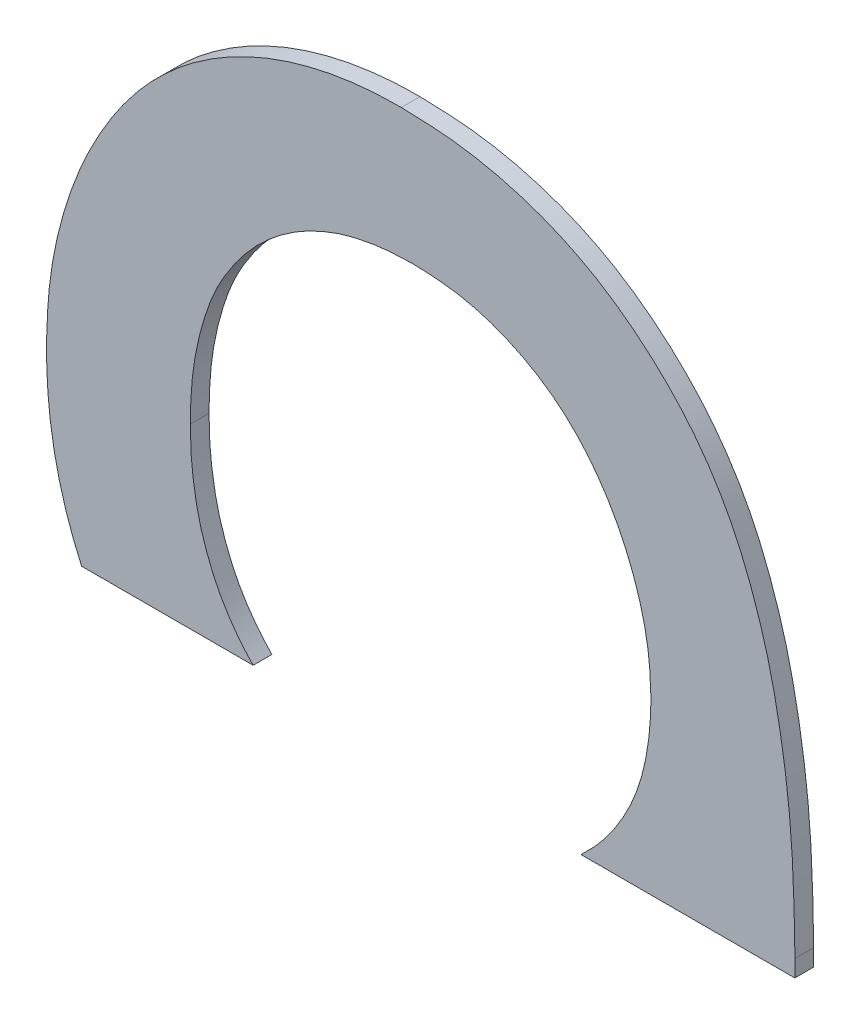
ISO-10303-21;
HEADER;
FILE_DESCRIPTION(('STEP AP214'),'2;1');
FILE_NAME('part.step','',(''),(''),'','','');
FILE_SCHEMA(('AUTOMOTIVE_DESIGN { 1 0 10303 214 1 1 1 1 }'));
ENDSEC;
DATA;
#1=APPLICATION_CONTEXT('core data for automotive mechanical design processes');
#2=APPLICATION_PROTOCOL_DEFINITION('international standard','automotive_design',2000,#1);
#3=PRODUCT_CONTEXT('',#1,'mechanical');
#4=PRODUCT('Part','Part','',(#3));
#5=PRODUCT_RELATED_PRODUCT_CATEGORY('part','',(#4));
#6=PRODUCT_DEFINITION_FORMATION('','',#4);
#7=PRODUCT_DEFINITION_CONTEXT('part definition',#1,'design');
#8=PRODUCT_DEFINITION('design','',#6,#7);
#9=PRODUCT_DEFINITION_SHAPE('','',#8);
#10=(LENGTH_UNIT() NAMED_UNIT(*) SI_UNIT(.MILLI.,.METRE.));
#11=(NAMED_UNIT(*) PLANE_ANGLE_UNIT() SI_UNIT($,.RADIAN.));
#12=(NAMED_UNIT(*) SI_UNIT($,.STERADIAN.) SOLID_ANGLE_UNIT());
#13=UNCERTAINTY_MEASURE_WITH_UNIT(LENGTH_MEASURE(1.E-05),#10,'distance_accuracy_value','');
#14=(GEOMETRIC_REPRESENTATION_CONTEXT(3) GLOBAL_UNCERTAINTY_ASSIGNED_CONTEXT((#13)) GLOBAL_UNIT_ASSIGNED_CONTEXT((#10,
#11,#12)) REPRESENTATION_CONTEXT('',''));
#15=CARTESIAN_POINT('',(0.,0.,0.));
#16=DIRECTION('',(0.,0.,1.));
#17=DIRECTION('',(1.,0.,0.));
#18=AXIS2_PLACEMENT_3D('',#15,#16,#17);
#19=CARTESIAN_POINT('',(-0.751201923076926,-4.61538461538461,0.5));
#20=CARTESIAN_POINT('',(-1.05208136722409,-4.6073141245753,0.5));
#21=CARTESIAN_POINT('',(-1.64652592040356,-4.59136933540342,0.5));
#22=CARTESIAN_POINT('',(-2.52174364885176,-4.46427746787016,0.5));
#23=CARTESIAN_POINT('',(-3.35965405508428,-4.24438969088595,0.5));
#24=CARTESIAN_POINT('',(-4.16805477719404,-3.95105285190534,0.5));
#25=CARTESIAN_POINT('',(-4.93626094891644,-3.56177482233258,0.5));
#26=CARTESIAN_POINT('',(-5.67726773130089,-3.09868306532259,0.5));
#27=CARTESIAN_POINT('',(-6.37478429479077,-2.53834942335427,0.5));
#28=CARTESIAN_POINT('',(-7.03748292644929,-1.90788221862828,0.5));
#29=CARTESIAN_POINT('',(-7.64393124396025,-1.20720674974773,0.5));
#30=CARTESIAN_POINT('',(-8.17223120863696,-0.449278447272661,0.5));
#31=CARTESIAN_POINT('',(-8.62332598090292,0.356403135815878,0.5));
#32=CARTESIAN_POINT('',(-8.98197896681654,1.21479841384775,0.5));
#33=CARTESIAN_POINT('',(-9.26618566706988,2.12202585891722,0.5));
#34=CARTESIAN_POINT('',(-9.46905048683821,3.07755895409878,0.5));
#35=CARTESIAN_POINT('',(-9.59116435200514,4.08337678900219,0.5));
#36=CARTESIAN_POINT('',(-9.60718732743484,4.76928467203447,0.5));
#37=CARTESIAN_POINT('',(-9.61538461538462,5.12019230769231,0.5));
#38=B_SPLINE_CURVE_WITH_KNOTS('',3,(#19,#20,#21,#22,#23,#24,#25,#26,#27,#28,#29,#30,#31,#32,#33,
#34,#35,#36,#37),.UNSPECIFIED.,.F.,.F.,(4,1,1,1,1,1,1,1,1,1,1,1,1,1,1,1,4),(0.,
0.0613500156391669,0.121208621404991,0.179871554014015,0.237779878975049,0.296247579069997,
0.355188698054684,0.415676988356908,0.478383266634535,0.54153119524827,0.604321267255817,
0.666503625249698,0.729484807150661,0.793706037151852,0.860134946175092,0.928445617023847,1.),.UNSPECIFIED.);
#39=DIRECTION('',(0.,0.,1.));
#40=VECTOR('',#39,1.);
#41=SURFACE_OF_LINEAR_EXTRUSION('',#38,#40);
#42=CARTESIAN_POINT('',(-8.67208105475277,0.5,0.49999999999993));
#43=VERTEX_POINT('',#42);
#44=CARTESIAN_POINT('',(-9.61538461538462,5.12019230769231,0.5));
#45=VERTEX_POINT('',#44);
#46=EDGE_CURVE('E136',#43,#45,#38,.T.);
#47=ORIENTED_EDGE('',*,*,#46,.F.);
#48=DIRECTION('',(0.,0.,1.));
#49=VECTOR('',#48,1.);
#50=CARTESIAN_POINT('',(-8.67208105475715,0.5,0.5));
#51=LINE('',#50,#49);
#52=CARTESIAN_POINT('',(-8.67208105475277,0.5,1.));
#53=VERTEX_POINT('',#52);
#54=EDGE_CURVE('E125',#43,#53,#51,.T.);
#55=ORIENTED_EDGE('',*,*,#54,.T.);
#56=CARTESIAN_POINT('',(-0.751201923076926,-4.61538461538461,1.));
#57=CARTESIAN_POINT('',(-1.05208136722409,-4.6073141245753,1.));
#58=CARTESIAN_POINT('',(-1.64652592040356,-4.59136933540342,1.));
#59=CARTESIAN_POINT('',(-2.52174364885176,-4.46427746787016,1.));
#60=CARTESIAN_POINT('',(-3.35965405508428,-4.24438969088595,1.));
#61=CARTESIAN_POINT('',(-4.16805477719404,-3.95105285190534,1.));
#62=CARTESIAN_POINT('',(-4.93626094891644,-3.56177482233258,1.));
#63=CARTESIAN_POINT('',(-5.67726773130089,-3.09868306532259,1.));
#64=CARTESIAN_POINT('',(-6.37478429479077,-2.53834942335427,1.));
#65=CARTESIAN_POINT('',(-7.03748292644929,-1.90788221862828,1.));
#66=CARTESIAN_POINT('',(-7.64393124396025,-1.20720674974773,1.));
#67=CARTESIAN_POINT('',(-8.17223120863696,-0.449278447272661,1.));
#68=CARTESIAN_POINT('',(-8.62332598090292,0.356403135815878,1.));
#69=CARTESIAN_POINT('',(-8.98197896681654,1.21479841384775,1.));
#70=CARTESIAN_POINT('',(-9.26618566706988,2.12202585891722,1.));
#71=CARTESIAN_POINT('',(-9.46905048683821,3.07755895409878,1.));
#72=CARTESIAN_POINT('',(-9.59116435200514,4.08337678900219,1.));
#73=CARTESIAN_POINT('',(-9.60718732743484,4.76928467203447,1.));
#74=CARTESIAN_POINT('',(-9.61538461538462,5.12019230769231,1.));
#75=B_SPLINE_CURVE_WITH_KNOTS('',3,(#56,#57,#58,#59,#60,#61,#62,#63,#64,#65,#66,#67,#68,#69,#70,
#71,#72,#73,#74),.UNSPECIFIED.,.F.,.F.,(4,1,1,1,1,1,1,1,1,1,1,1,1,1,1,1,4),(0.,
0.0613500156391669,0.121208621404991,0.179871554014015,0.237779878975049,0.296247579069997,
0.355188698054684,0.415676988356908,0.478383266634535,0.54153119524827,0.604321267255817,
0.666503625249698,0.729484807150661,0.793706037151852,0.860134946175092,0.928445617023847,1.),.UNSPECIFIED.);
#76=CARTESIAN_POINT('',(-9.61538461538462,5.12019230769231,1.));
#77=VERTEX_POINT('',#76);
#78=EDGE_CURVE('E127',#53,#77,#75,.T.);
#79=ORIENTED_EDGE('',*,*,#78,.T.);
#80=DIRECTION('',(0.,0.,1.));
#81=VECTOR('',#80,1.);
#82=CARTESIAN_POINT('',(-9.61538461538462,5.12019230769231,0.5));
#83=LINE('',#82,#81);
#84=EDGE_CURVE('E143',#45,#77,#83,.T.);
#85=ORIENTED_EDGE('',*,*,#84,.F.);
#86=EDGE_LOOP('',(#47,#55,#79,#85));
#87=FACE_BOUND('',#86,.T.);
#88=ADVANCED_FACE('F39',(#87),#41,.F.);
#89=CARTESIAN_POINT('',(10.3846153846154,0.955528846153846,0.5));
#90=CARTESIAN_POINT('',(10.3821977142456,0.602943470335043,0.5));
#91=CARTESIAN_POINT('',(10.3774297635366,-0.0923993330622221,0.5));
#92=CARTESIAN_POINT('',(10.3430890811823,-1.11663879616051,0.5));
#93=CARTESIAN_POINT('',(10.2753772341115,-2.10441400548949,0.5));
#94=CARTESIAN_POINT('',(10.1863756728696,-3.05443693995836,0.5));
#95=CARTESIAN_POINT('',(10.0717015147196,-3.9682283986958,0.5));
#96=CARTESIAN_POINT('',(9.93709266733864,-4.84519617463858,0.5));
#97=CARTESIAN_POINT('',(9.76535153213138,-5.68411287015175,0.5));
#98=CARTESIAN_POINT('',(9.57638652763186,-6.48683172140972,0.5));
#99=CARTESIAN_POINT('',(9.35717288971194,-7.25390389678419,0.5));
#100=CARTESIAN_POINT('',(9.12160097875744,-7.98629697891753,0.5));
#101=CARTESIAN_POINT('',(8.84819772702446,-8.67864494150063,0.5));
#102=CARTESIAN_POINT('',(8.55475591867812,-9.33514237132313,0.5));
#103=CARTESIAN_POINT('',(8.23544144492812,-9.95482744519533,0.5));
#104=CARTESIAN_POINT('',(7.8954990200966,-10.5400820912108,0.5));
#105=CARTESIAN_POINT('',(7.51972152317449,-11.083398874254,0.5));
#106=CARTESIAN_POINT('',(7.24946852493487,-11.4237069092656,0.5));
#107=CARTESIAN_POINT('',(7.11538461538461,-11.5925480769231,0.5));
#108=B_SPLINE_CURVE_WITH_KNOTS('',3,(#89,#90,#91,#92,#93,#94,#95,#96,#97,#98,#99,#100,#101,#102,
#103,#104,#105,#106,#107),.UNSPECIFIED.,.F.,.F.,(4,1,1,1,1,1,1,1,1,1,1,1,1,1,1,1,4),(0.,
0.0800277717235732,0.157824853088924,0.232558913600784,0.304720401798522,0.374368665994503,
0.441569713459507,0.506038880147261,0.568678357004664,0.628697033085732,0.687072628177058,
0.743220712025028,0.797557571320743,0.850225217791088,0.901379566966964,0.951070244146251,1.),.UNSPECIFIED.);
#109=DIRECTION('',(0.,0.,1.));
#110=VECTOR('',#109,1.);
#111=SURFACE_OF_LINEAR_EXTRUSION('',#108,#110);
#112=CARTESIAN_POINT('',(10.3846153846154,0.955528846153846,1.));
#113=CARTESIAN_POINT('',(10.3821977142456,0.602943470335043,1.));
#114=CARTESIAN_POINT('',(10.3774297635366,-0.0923993330622221,1.));
#115=CARTESIAN_POINT('',(10.3430890811823,-1.11663879616051,1.));
#116=CARTESIAN_POINT('',(10.2753772341115,-2.10441400548949,1.));
#117=CARTESIAN_POINT('',(10.1863756728696,-3.05443693995836,1.));
#118=CARTESIAN_POINT('',(10.0717015147196,-3.9682283986958,1.));
#119=CARTESIAN_POINT('',(9.93709266733864,-4.84519617463858,1.));
#120=CARTESIAN_POINT('',(9.76535153213138,-5.68411287015175,1.));
#121=CARTESIAN_POINT('',(9.57638652763186,-6.48683172140972,1.));
#122=CARTESIAN_POINT('',(9.35717288971194,-7.25390389678419,1.));
#123=CARTESIAN_POINT('',(9.12160097875744,-7.98629697891753,1.));
#124=CARTESIAN_POINT('',(8.84819772702446,-8.67864494150063,1.));
#125=CARTESIAN_POINT('',(8.55475591867812,-9.33514237132313,1.));
#126=CARTESIAN_POINT('',(8.23544144492812,-9.95482744519533,1.));
#127=CARTESIAN_POINT('',(7.8954990200966,-10.5400820912108,1.));
#128=CARTESIAN_POINT('',(7.51972152317449,-11.083398874254,1.));
#129=CARTESIAN_POINT('',(7.24946852493487,-11.4237069092656,1.));
#130=CARTESIAN_POINT('',(7.11538461538461,-11.5925480769231,1.));
#131=B_SPLINE_CURVE_WITH_KNOTS('',3,(#112,#113,#114,#115,#116,#117,#118,#119,#120,#121,#122,
#123,#124,#125,#126,#127,#128,#129,#130),.UNSPECIFIED.,.F.,.F.,(4,1,1,1,1,1,1,1,1,1,1,1,1,1,1,1,
4),(0.,0.0800277717235732,0.157824853088924,0.232558913600784,0.304720401798522,
0.374368665994503,0.441569713459507,0.506038880147261,0.568678357004664,0.628697033085732,
0.687072628177058,0.743220712025028,0.797557571320743,0.850225217791088,0.901379566966964,
0.951070244146251,1.),.UNSPECIFIED.);
#132=CARTESIAN_POINT('',(10.3846153846154,0.955528846153846,1.));
#133=VERTEX_POINT('',#132);
#134=CARTESIAN_POINT('',(10.3811111009625,0.5,1.));
#135=VERTEX_POINT('',#134);
#136=EDGE_CURVE('E158',#133,#135,#131,.T.);
#137=ORIENTED_EDGE('',*,*,#136,.T.);
#138=DIRECTION('',(0.,0.,1.));
#139=VECTOR('',#138,1.);
#140=CARTESIAN_POINT('',(10.3811111009625,0.5,0.5));
#141=LINE('',#140,#139);
#142=CARTESIAN_POINT('',(10.3811111009625,0.5,0.499999999999928));
#143=VERTEX_POINT('',#142);
#144=EDGE_CURVE('E58',#135,#143,#141,.F.);
#145=ORIENTED_EDGE('',*,*,#144,.T.);
#146=CARTESIAN_POINT('',(10.3846153846154,0.955528846153846,0.5));
#147=VERTEX_POINT('',#146);
#148=EDGE_CURVE('E153',#147,#143,#108,.T.);
#149=ORIENTED_EDGE('',*,*,#148,.F.);
#150=DIRECTION('',(0.,0.,1.));
#151=VECTOR('',#150,1.);
#152=CARTESIAN_POINT('',(10.3846153846154,0.955528846153846,0.5));
#153=LINE('',#152,#151);
#154=EDGE_CURVE('E202',#147,#133,#153,.T.);
#155=ORIENTED_EDGE('',*,*,#154,.T.);
#156=EDGE_LOOP('',(#137,#145,#149,#155));
#157=FACE_BOUND('',#156,.T.);
#158=ADVANCED_FACE('F170',(#157),#111,.F.);
#159=CARTESIAN_POINT('',(-6.48674058951894,-12.9439054380009,0.5));
#160=DIRECTION('',(0.,0.,1.));
#161=DIRECTION('',(0.,-1.,0.));
#162=AXIS2_PLACEMENT_3D('',#159,#160,#161);
#163=PLANE('',#162);
#164=ORIENTED_EDGE('',*,*,#148,.T.);
#165=DIRECTION('',(-1.,0.,0.));
#166=VECTOR('',#165,1.);
#167=CARTESIAN_POINT('',(-6.48674058951894,0.5,0.499999999999929));
#168=LINE('',#167,#166);
#169=CARTESIAN_POINT('',(4.66752853540583,0.500000000000001,0.5));
#170=VERTEX_POINT('',#169);
#171=EDGE_CURVE('E145',#143,#170,#168,.T.);
#172=ORIENTED_EDGE('',*,*,#171,.T.);
#173=CARTESIAN_POINT('',(0.312499999999997,-1.15384615384615,0.5));
#174=CARTESIAN_POINT('',(0.525181620843557,-1.15052628186562,0.5));
#175=CARTESIAN_POINT('',(0.944290969527386,-1.14398415858315,0.5));
#176=CARTESIAN_POINT('',(1.55888442998283,-1.05335744478311,0.5));
#177=CARTESIAN_POINT('',(2.15135861981619,-0.924500664957572,0.5));
#178=CARTESIAN_POINT('',(2.71873350548303,-0.736200358989074,0.5));
#179=CARTESIAN_POINT('',(3.26187993920832,-0.497381270453801,0.5));
#180=CARTESIAN_POINT('',(3.77444532617358,-0.195966551531516,0.5));
#181=CARTESIAN_POINT('',(4.27230429312932,0.14266349233154,0.5));
#182=CARTESIAN_POINT('',(4.72925431112541,0.548351553100201,0.5));
#183=CARTESIAN_POINT('',(5.15751420700751,0.986063218768481,0.5));
#184=CARTESIAN_POINT('',(5.52382964577491,1.4714058416857,0.5));
#185=CARTESIAN_POINT('',(5.83829932064355,1.98443429725264,0.5));
#186=CARTESIAN_POINT('',(6.10014231192655,2.52874864371322,0.5));
#187=CARTESIAN_POINT('',(6.29906273963224,3.10979085232619,0.5));
#188=CARTESIAN_POINT('',(6.43408372567748,3.7250009629822,0.5));
#189=CARTESIAN_POINT('',(6.52116993396109,4.37253099910386,0.5));
#190=CARTESIAN_POINT('',(6.53260799394781,4.81541624209692,0.5));
#191=CARTESIAN_POINT('',(6.53846153846154,5.04206730769231,0.5));
#192=B_SPLINE_CURVE_WITH_KNOTS('',3,(#173,#174,#175,#176,#177,#178,#179,#180,#181,#182,#183,
#184,#185,#186,#187,#188,#189,#190,#191),.UNSPECIFIED.,.F.,.F.,(4,1,1,1,1,1,1,1,1,1,1,1,1,1,1,1,
4),(0.,0.0648134675243328,0.127721098101111,0.189090647128161,0.249568581464557,
0.309746375316349,0.369694185537686,0.43071293525297,0.493078171473314,0.555739028721918,
0.617208872237963,0.678092868476808,0.739038153231513,0.801064241544692,0.864952355745952,
0.930887982924266,1.),.UNSPECIFIED.);
#193=CARTESIAN_POINT('',(6.53846153846154,5.04206730769231,0.5));
#194=VERTEX_POINT('',#193);
#195=EDGE_CURVE('E185',#170,#194,#192,.T.);
#196=ORIENTED_EDGE('',*,*,#195,.T.);
#197=CARTESIAN_POINT('',(6.53846153846154,5.04206730769231,0.5));
#198=CARTESIAN_POINT('',(6.52770505709414,5.34320083488285,0.5));
#199=CARTESIAN_POINT('',(6.50633330664684,5.94151457472179,0.5));
#200=CARTESIAN_POINT('',(6.34496615532058,6.82804757866898,0.5));
#201=CARTESIAN_POINT('',(6.07701568166938,7.69179131329034,0.5));
#202=CARTESIAN_POINT('',(5.71500345606536,8.52585861030982,0.5));
#203=CARTESIAN_POINT('',(5.26329480367352,9.30225326856521,0.5));
#204=CARTESIAN_POINT('',(4.73337273483055,9.99465493542181,0.5));
#205=CARTESIAN_POINT('',(4.1266913803003,10.58490349229,0.5));
#206=CARTESIAN_POINT('',(3.44726882169802,11.0701727775004,0.5));
#207=CARTESIAN_POINT('',(2.70412349955887,11.4471876199604,0.5));
#208=CARTESIAN_POINT('',(1.90787075377625,11.7300672949242,0.5));
#209=CARTESIAN_POINT('',(1.05231904469708,11.8932703093732,0.5));
#210=CARTESIAN_POINT('',(0.463427389534738,11.9129913139496,0.5));
#211=CARTESIAN_POINT('',(0.162259615384613,11.9230769230769,0.5));
#212=B_SPLINE_CURVE_WITH_KNOTS('',3,(#197,#198,#199,#200,#201,#202,#203,#204,#205,#206,#207,
#208,#209,#210,#211),.UNSPECIFIED.,.F.,.F.,(4,1,1,1,1,1,1,1,1,1,1,1,4),(0.,0.0861976277555787,
0.171263643436991,0.257086364057951,0.344684993816873,0.431063751283395,0.513672891938998,
0.593587340757752,0.672538692657252,0.751810301585755,0.831452538960071,0.913802372244421,1.),.UNSPECIFIED.);
#213=CARTESIAN_POINT('',(0.162259615384613,11.9230769230769,0.5));
#214=VERTEX_POINT('',#213);
#215=EDGE_CURVE('E186',#194,#214,#212,.T.);
#216=ORIENTED_EDGE('',*,*,#215,.T.);
#217=CARTESIAN_POINT('',(0.162259615384613,11.9230769230769,0.5));
#218=CARTESIAN_POINT('',(-0.0524070483761286,11.9172976812207,0.5));
#219=CARTESIAN_POINT('',(-0.47141739011508,11.9060171122552,0.5));
#220=CARTESIAN_POINT('',(-1.08474570451024,11.8178428606085,0.5));
#221=CARTESIAN_POINT('',(-1.66874208938719,11.6845769858313,0.5));
#222=CARTESIAN_POINT('',(-2.22066504010848,11.4806116659245,0.5));
#223=CARTESIAN_POINT('',(-2.74435856761598,11.2309346759247,0.5));
#224=CARTESIAN_POINT('',(-3.2372152886433,10.9188549561527,0.5));
#225=CARTESIAN_POINT('',(-3.69936923709171,10.5531208923731,0.5));
#226=CARTESIAN_POINT('',(-4.12583437983045,10.1314299110723,0.5));
#227=CARTESIAN_POINT('',(-4.51131732161061,9.66256324088065,0.5));
#228=CARTESIAN_POINT('',(-4.84623747019051,9.14924678946766,0.5));
#229=CARTESIAN_POINT('',(-5.1420069466192,8.59996710435281,0.5));
#230=CARTESIAN_POINT('',(-5.36447190921372,8.0012145581238,0.5));
#231=CARTESIAN_POINT('',(-5.54574891097962,7.36833168254641,0.5));
#232=CARTESIAN_POINT('',(-5.67902205628037,6.69533350531248,0.5));
#233=CARTESIAN_POINT('',(-5.75726742914501,5.98144755626492,0.5));
#234=CARTESIAN_POINT('',(-5.76518523772485,5.49098298120125,0.5));
#235=CARTESIAN_POINT('',(-5.76923076923077,5.24038461538462,0.5));
#236=B_SPLINE_CURVE_WITH_KNOTS('',3,(#217,#218,#219,#220,#221,#222,#223,#224,#225,#226,#227,
#228,#229,#230,#231,#232,#233,#234,#235),.UNSPECIFIED.,.F.,.F.,(4,1,1,1,1,1,1,1,1,1,1,1,1,1,1,1,
4),(0.,0.063966376214778,0.124856708945873,0.18438779716389,0.242192626151957,0.299883213184887,
0.357042851091169,0.415705001881656,0.475245074794211,0.535496623465662,0.596281447262161,
0.657719827357932,0.721044660647972,0.786256059909936,0.853830758406699,0.925316169733188,1.),.UNSPECIFIED.);
#237=CARTESIAN_POINT('',(-5.76923076923077,5.24038461538462,0.5));
#238=VERTEX_POINT('',#237);
#239=EDGE_CURVE('E191',#214,#238,#236,.T.);
#240=ORIENTED_EDGE('',*,*,#239,.T.);
#241=CARTESIAN_POINT('',(-5.76923076923077,5.24038461538462,0.5));
#242=CARTESIAN_POINT('',(-5.76548307373403,4.99973713439808,0.5));
#243=CARTESIAN_POINT('',(-5.75815398225742,4.52912061731442,0.5));
#244=CARTESIAN_POINT('',(-5.67552539760887,3.84241663759643,0.5));
#245=CARTESIAN_POINT('',(-5.55546886049067,3.19314256278714,0.5));
#246=CARTESIAN_POINT('',(-5.36950630431865,2.58541542280607,0.5));
#247=CARTESIAN_POINT('',(-5.14577017622293,2.01570219900155,0.5));
#248=CARTESIAN_POINT('',(-4.86555757943063,1.4856655008551,0.5));
#249=CARTESIAN_POINT('',(-4.53315107267522,0.995798413937763,0.5));
#250=CARTESIAN_POINT('',(-4.14927139890298,0.547436953164793,0.5));
#251=CARTESIAN_POINT('',(-3.72466431145232,0.143143069699442,0.5));
#252=CARTESIAN_POINT('',(-3.25437334938526,-0.202549579727881,0.5));
#253=CARTESIAN_POINT('',(-2.75047616777364,-0.496086072099569,0.5));
#254=CARTESIAN_POINT('',(-2.20943647475582,-0.74007647590807,0.5));
#255=CARTESIAN_POINT('',(-1.63050325211092,-0.925636184295902,0.5));
#256=CARTESIAN_POINT('',(-1.0140014190199,-1.05446425752607,0.5));
#257=CARTESIAN_POINT('',(-0.363202494055206,-1.14432663576168,0.5));
#258=CARTESIAN_POINT('',(0.0838132339991019,-1.15062433977298,0.5));
#259=CARTESIAN_POINT('',(0.312499999999997,-1.15384615384615,0.5));
#260=B_SPLINE_CURVE_WITH_KNOTS('',3,(#241,#242,#243,#244,#245,#246,#247,#248,#249,#250,#251,
#252,#253,#254,#255,#256,#257,#258,#259),.UNSPECIFIED.,.F.,.F.,(4,1,1,1,1,1,1,1,1,1,1,1,1,1,1,1,
4),(0.,0.0722026535685907,0.141201400518914,0.207364092776097,0.270147375692274,
0.331676873716226,0.390857640059306,0.449735156775021,0.50902581116344,0.567731099086861,
0.62534201751626,0.683822031340533,0.742499592485817,0.80316493575478,0.865913649548624,
0.931403366984299,1.),.UNSPECIFIED.);
#261=CARTESIAN_POINT('',(-4.08978851176382,0.500000000000275,0.5));
#262=VERTEX_POINT('',#261);
#263=EDGE_CURVE('E139',#238,#262,#260,.T.);
#264=ORIENTED_EDGE('',*,*,#263,.T.);
#265=EDGE_CURVE('E79',#262,#43,#168,.T.);
#266=ORIENTED_EDGE('',*,*,#265,.T.);
#267=ORIENTED_EDGE('',*,*,#46,.T.);
#268=CARTESIAN_POINT('',(-9.61538461538462,5.12019230769231,0.5));
#269=CARTESIAN_POINT('',(-9.60013607534619,5.5838327825477,0.5));
#270=CARTESIAN_POINT('',(-9.56997848151247,6.50079146123629,0.5));
#271=CARTESIAN_POINT('',(-9.33662604321627,7.8496407777572,0.5));
#272=CARTESIAN_POINT('',(-8.94723350653155,9.14486629344687,0.5));
#273=CARTESIAN_POINT('',(-8.50557914437759,10.1789299143658,0.5));
#274=CARTESIAN_POINT('',(-8.07302318003243,10.9589854086016,0.5));
#275=CARTESIAN_POINT('',(-7.72570830842158,11.5155968429855,0.5));
#276=CARTESIAN_POINT('',(-7.34350336567869,12.0335330731219,0.5));
#277=CARTESIAN_POINT('',(-6.93892276515152,12.5221374587878,0.5));
#278=CARTESIAN_POINT('',(-6.49431786775328,12.9652269768164,0.5));
#279=CARTESIAN_POINT('',(-6.03519306397904,13.3846599397692,0.5));
#280=CARTESIAN_POINT('',(-5.5360494398483,13.7559741310356,0.5));
#281=CARTESIAN_POINT('',(-5.01711813600273,14.1002929598784,0.5));
#282=CARTESIAN_POINT('',(-4.46778963448643,14.3981548156166,0.5));
#283=CARTESIAN_POINT('',(-3.90339254087081,14.6648405130691,0.5));
#284=CARTESIAN_POINT('',(-3.3186901850066,14.8877350046006,0.5));
#285=CARTESIAN_POINT('',(-2.7152482035707,15.0664912090141,0.5));
#286=CARTESIAN_POINT('',(-2.09577346865924,15.2128372401944,0.5));
#287=CARTESIAN_POINT('',(-1.45703158228145,15.3137269738378,0.5));
#288=CARTESIAN_POINT('',(-0.800533718614585,15.3758816814129,0.5));
#289=CARTESIAN_POINT('',(-0.356710425498516,15.3816816099975,0.5));
#290=CARTESIAN_POINT('',(-0.132211538461541,15.3846153846154,0.5));
#291=B_SPLINE_CURVE_WITH_KNOTS('',3,(#268,#269,#270,#271,#272,#273,#274,#275,#276,#277,#278,
#279,#280,#281,#282,#283,#284,#285,#286,#287,#288,#289,#290),.UNSPECIFIED.,.F.,.F.,(4,1,1,1,1,1,
1,1,1,1,1,1,1,1,1,1,1,1,1,1,4),(0.,0.0888853441126809,0.175791787198397,0.261603583513475,
0.347814341004113,0.39080100085083,0.432582805512908,0.473538685001744,0.514168938374178,
0.554103040294512,0.593824059997179,0.633317770529986,0.673275888520076,0.713165615093521,
0.753038688179558,0.792922864363155,0.833032136912216,0.87366239028465,0.914905556974018,
0.956956725686391,1.),.UNSPECIFIED.);
#292=CARTESIAN_POINT('',(-0.132211538461541,15.3846153846154,0.5));
#293=VERTEX_POINT('',#292);
#294=EDGE_CURVE('E147',#45,#293,#291,.T.);
#295=ORIENTED_EDGE('',*,*,#294,.T.);
#296=CARTESIAN_POINT('',(-0.132211538461541,15.3846153846154,0.5));
#297=CARTESIAN_POINT('',(0.246915326032293,15.3740754197486,0.5));
#298=CARTESIAN_POINT('',(0.990449774331535,15.3534046952596,0.5));
#299=CARTESIAN_POINT('',(2.07890254784544,15.1953701834956,0.5));
#300=CARTESIAN_POINT('',(3.11356364576041,14.928831534157,0.5));
#301=CARTESIAN_POINT('',(4.09623526251795,14.5633365078258,0.5));
#302=CARTESIAN_POINT('',(5.02479405636027,14.0909902832536,0.5));
#303=CARTESIAN_POINT('',(5.89601949043016,13.507563274818,0.5));
#304=CARTESIAN_POINT('',(6.71366099507178,12.8202750409311,0.5));
#305=CARTESIAN_POINT('',(7.47887395764709,12.0287752095609,0.5));
#306=CARTESIAN_POINT('',(8.17013952617736,11.112136198358,0.500000000000001));
#307=CARTESIAN_POINT('',(8.77276591066458,10.0618232214293,0.5));
#308=CARTESIAN_POINT('',(9.26637927204009,8.86911714389148,0.5));
#309=CARTESIAN_POINT('',(9.68329569913522,7.54890239099409,0.5));
#310=CARTESIAN_POINT('',(9.99197157178046,6.08868938649425,0.5));
#311=CARTESIAN_POINT('',(10.2300278903066,4.49791014604374,0.5));
#312=CARTESIAN_POINT('',(10.3552388411311,2.77043362695744,0.5));
#313=CARTESIAN_POINT('',(10.3745934177007,1.57469344175062,0.5));
#314=CARTESIAN_POINT('',(10.3846153846154,0.955528846153846,0.5));
#315=B_SPLINE_CURVE_WITH_KNOTS('',3,(#296,#297,#298,#299,#300,#301,#302,#303,#304,#305,#306,
#307,#308,#309,#310,#311,#312,#313,#314),.UNSPECIFIED.,.F.,.F.,(4,1,1,1,1,1,1,1,1,1,1,1,1,1,1,1,
4),(0.,0.0561530752402382,0.110126054704138,0.162526751603415,0.214176657913401,
0.265142520249018,0.316503442676227,0.369168192174527,0.423109342411009,0.479258496429254,
0.538816902643743,0.601984297884428,0.670126449080619,0.743646970381142,0.822844518962503,
0.908267361813752,1.),.UNSPECIFIED.);
#316=EDGE_CURVE('E149',#293,#147,#315,.T.);
#317=ORIENTED_EDGE('',*,*,#316,.T.);
#318=EDGE_LOOP('',(#164,#172,#196,#216,#240,#264,#266,#267,#295,#317));
#319=FACE_BOUND('',#318,.T.);
#320=ADVANCED_FACE('F134',(#319),#163,.F.);
#321=CARTESIAN_POINT('',(-6.48674058951894,-12.9439054380009,1.));
#322=DIRECTION('',(0.,0.,1.));
#323=DIRECTION('',(0.,-1.,0.));
#324=AXIS2_PLACEMENT_3D('',#321,#322,#323);
#325=PLANE('',#324);
#326=ORIENTED_EDGE('',*,*,#78,.F.);
#327=DIRECTION('',(1.,0.,0.));
#328=VECTOR('',#327,1.);
#329=CARTESIAN_POINT('',(-17.,0.5,1.));
#330=LINE('',#329,#328);
#331=CARTESIAN_POINT('',(-4.08978851176355,0.5,1.));
#332=VERTEX_POINT('',#331);
#333=EDGE_CURVE('E128',#53,#332,#330,.T.);
#334=ORIENTED_EDGE('',*,*,#333,.T.);
#335=CARTESIAN_POINT('',(-5.76923076923077,5.24038461538462,1.));
#336=CARTESIAN_POINT('',(-5.76548307373403,4.99973713439808,1.));
#337=CARTESIAN_POINT('',(-5.75815398225742,4.52912061731442,1.));
#338=CARTESIAN_POINT('',(-5.67552539760887,3.84241663759643,1.));
#339=CARTESIAN_POINT('',(-5.55546886049067,3.19314256278714,1.));
#340=CARTESIAN_POINT('',(-5.36950630431865,2.58541542280607,1.));
#341=CARTESIAN_POINT('',(-5.14577017622293,2.01570219900155,1.));
#342=CARTESIAN_POINT('',(-4.86555757943063,1.4856655008551,1.));
#343=CARTESIAN_POINT('',(-4.53315107267522,0.995798413937763,1.));
#344=CARTESIAN_POINT('',(-4.14927139890298,0.547436953164793,1.));
#345=CARTESIAN_POINT('',(-3.72466431145232,0.143143069699442,1.));
#346=CARTESIAN_POINT('',(-3.25437334938526,-0.202549579727881,1.));
#347=CARTESIAN_POINT('',(-2.75047616777364,-0.496086072099569,1.));
#348=CARTESIAN_POINT('',(-2.20943647475582,-0.74007647590807,1.));
#349=CARTESIAN_POINT('',(-1.63050325211092,-0.925636184295902,1.));
#350=CARTESIAN_POINT('',(-1.0140014190199,-1.05446425752607,1.));
#351=CARTESIAN_POINT('',(-0.363202494055206,-1.14432663576168,1.));
#352=CARTESIAN_POINT('',(0.0838132339991019,-1.15062433977298,1.));
#353=CARTESIAN_POINT('',(0.312499999999997,-1.15384615384615,1.));
#354=B_SPLINE_CURVE_WITH_KNOTS('',3,(#335,#336,#337,#338,#339,#340,#341,#342,#343,#344,#345,
#346,#347,#348,#349,#350,#351,#352,#353),.UNSPECIFIED.,.F.,.F.,(4,1,1,1,1,1,1,1,1,1,1,1,1,1,1,1,
4),(0.,0.0722026535685907,0.141201400518914,0.207364092776097,0.270147375692274,
0.331676873716226,0.390857640059306,0.449735156775021,0.50902581116344,0.567731099086861,
0.62534201751626,0.683822031340533,0.742499592485817,0.80316493575478,0.865913649548624,
0.931403366984299,1.),.UNSPECIFIED.);
#355=CARTESIAN_POINT('',(-5.76923076923077,5.24038461538462,1.));
#356=VERTEX_POINT('',#355);
#357=EDGE_CURVE('E375',#356,#332,#354,.T.);
#358=ORIENTED_EDGE('',*,*,#357,.F.);
#359=CARTESIAN_POINT('',(0.162259615384613,11.9230769230769,1.));
#360=CARTESIAN_POINT('',(-0.0524070483761286,11.9172976812207,1.));
#361=CARTESIAN_POINT('',(-0.47141739011508,11.9060171122552,1.));
#362=CARTESIAN_POINT('',(-1.08474570451024,11.8178428606085,1.));
#363=CARTESIAN_POINT('',(-1.66874208938719,11.6845769858313,1.));
#364=CARTESIAN_POINT('',(-2.22066504010848,11.4806116659245,1.));
#365=CARTESIAN_POINT('',(-2.74435856761598,11.2309346759247,1.));
#366=CARTESIAN_POINT('',(-3.2372152886433,10.9188549561527,1.));
#367=CARTESIAN_POINT('',(-3.69936923709171,10.5531208923731,1.));
#368=CARTESIAN_POINT('',(-4.12583437983045,10.1314299110723,1.));
#369=CARTESIAN_POINT('',(-4.51131732161061,9.66256324088065,1.));
#370=CARTESIAN_POINT('',(-4.84623747019051,9.14924678946766,1.));
#371=CARTESIAN_POINT('',(-5.1420069466192,8.59996710435281,1.));
#372=CARTESIAN_POINT('',(-5.36447190921372,8.0012145581238,1.));
#373=CARTESIAN_POINT('',(-5.54574891097962,7.36833168254641,1.));
#374=CARTESIAN_POINT('',(-5.67902205628037,6.69533350531248,1.));
#375=CARTESIAN_POINT('',(-5.75726742914501,5.98144755626492,1.));
#376=CARTESIAN_POINT('',(-5.76518523772485,5.49098298120125,1.));
#377=CARTESIAN_POINT('',(-5.76923076923077,5.24038461538462,1.));
#378=B_SPLINE_CURVE_WITH_KNOTS('',3,(#359,#360,#361,#362,#363,#364,#365,#366,#367,#368,#369,
#370,#371,#372,#373,#374,#375,#376,#377),.UNSPECIFIED.,.F.,.F.,(4,1,1,1,1,1,1,1,1,1,1,1,1,1,1,1,
4),(0.,0.063966376214778,0.124856708945873,0.18438779716389,0.242192626151957,0.299883213184887,
0.357042851091169,0.415705001881656,0.475245074794211,0.535496623465662,0.596281447262161,
0.657719827357932,0.721044660647972,0.786256059909936,0.853830758406699,0.925316169733188,1.),.UNSPECIFIED.);
#379=CARTESIAN_POINT('',(0.162259615384613,11.9230769230769,1.));
#380=VERTEX_POINT('',#379);
#381=EDGE_CURVE('E392',#380,#356,#378,.T.);
#382=ORIENTED_EDGE('',*,*,#381,.F.);
#383=CARTESIAN_POINT('',(6.53846153846154,5.04206730769231,1.));
#384=CARTESIAN_POINT('',(6.52770505709414,5.34320083488285,1.));
#385=CARTESIAN_POINT('',(6.50633330664684,5.94151457472179,1.));
#386=CARTESIAN_POINT('',(6.34496615532058,6.82804757866898,1.));
#387=CARTESIAN_POINT('',(6.07701568166938,7.69179131329034,1.));
#388=CARTESIAN_POINT('',(5.71500345606536,8.52585861030982,1.));
#389=CARTESIAN_POINT('',(5.26329480367352,9.30225326856521,1.));
#390=CARTESIAN_POINT('',(4.73337273483055,9.99465493542181,1.));
#391=CARTESIAN_POINT('',(4.1266913803003,10.58490349229,1.));
#392=CARTESIAN_POINT('',(3.44726882169802,11.0701727775004,1.));
#393=CARTESIAN_POINT('',(2.70412349955887,11.4471876199604,1.));
#394=CARTESIAN_POINT('',(1.90787075377625,11.7300672949242,1.));
#395=CARTESIAN_POINT('',(1.05231904469708,11.8932703093732,1.));
#396=CARTESIAN_POINT('',(0.463427389534738,11.9129913139496,1.));
#397=CARTESIAN_POINT('',(0.162259615384613,11.9230769230769,1.));
#398=B_SPLINE_CURVE_WITH_KNOTS('',3,(#383,#384,#385,#386,#387,#388,#389,#390,#391,#392,#393,
#394,#395,#396,#397),.UNSPECIFIED.,.F.,.F.,(4,1,1,1,1,1,1,1,1,1,1,1,4),(0.,0.0861976277555787,
0.171263643436991,0.257086364057951,0.344684993816873,0.431063751283395,0.513672891938998,
0.593587340757752,0.672538692657252,0.751810301585755,0.831452538960071,0.913802372244421,1.),.UNSPECIFIED.);
#399=CARTESIAN_POINT('',(6.53846153846154,5.04206730769231,1.));
#400=VERTEX_POINT('',#399);
#401=EDGE_CURVE('E51',#400,#380,#398,.T.);
#402=ORIENTED_EDGE('',*,*,#401,.F.);
#403=CARTESIAN_POINT('',(0.312499999999997,-1.15384615384615,1.));
#404=CARTESIAN_POINT('',(0.525181620843557,-1.15052628186562,1.));
#405=CARTESIAN_POINT('',(0.944290969527386,-1.14398415858315,1.));
#406=CARTESIAN_POINT('',(1.55888442998283,-1.05335744478311,1.));
#407=CARTESIAN_POINT('',(2.15135861981619,-0.924500664957572,1.));
#408=CARTESIAN_POINT('',(2.71873350548303,-0.736200358989074,1.));
#409=CARTESIAN_POINT('',(3.26187993920832,-0.497381270453801,1.));
#410=CARTESIAN_POINT('',(3.77444532617358,-0.195966551531516,1.));
#411=CARTESIAN_POINT('',(4.27230429312932,0.14266349233154,1.));
#412=CARTESIAN_POINT('',(4.72925431112541,0.548351553100201,1.));
#413=CARTESIAN_POINT('',(5.15751420700751,0.986063218768481,1.));
#414=CARTESIAN_POINT('',(5.52382964577491,1.4714058416857,1.));
#415=CARTESIAN_POINT('',(5.83829932064355,1.98443429725264,1.));
#416=CARTESIAN_POINT('',(6.10014231192655,2.52874864371322,1.));
#417=CARTESIAN_POINT('',(6.29906273963224,3.10979085232619,1.));
#418=CARTESIAN_POINT('',(6.43408372567748,3.7250009629822,1.));
#419=CARTESIAN_POINT('',(6.52116993396109,4.37253099910386,1.));
#420=CARTESIAN_POINT('',(6.53260799394781,4.81541624209692,1.));
#421=CARTESIAN_POINT('',(6.53846153846154,5.04206730769231,1.));
#422=B_SPLINE_CURVE_WITH_KNOTS('',3,(#403,#404,#405,#406,#407,#408,#409,#410,#411,#412,#413,
#414,#415,#416,#417,#418,#419,#420,#421),.UNSPECIFIED.,.F.,.F.,(4,1,1,1,1,1,1,1,1,1,1,1,1,1,1,1,
4),(0.,0.0648134675243328,0.127721098101111,0.189090647128161,0.249568581464557,
0.309746375316349,0.369694185537686,0.43071293525297,0.493078171473314,0.555739028721918,
0.617208872237963,0.678092868476808,0.739038153231513,0.801064241544692,0.864952355745952,
0.930887982924266,1.),.UNSPECIFIED.);
#423=CARTESIAN_POINT('',(4.66752853540653,0.500000000000662,1.));
#424=VERTEX_POINT('',#423);
#425=EDGE_CURVE('E43',#424,#400,#422,.T.);
#426=ORIENTED_EDGE('',*,*,#425,.F.);
#427=EDGE_CURVE('E122',#424,#135,#330,.T.);
#428=ORIENTED_EDGE('',*,*,#427,.T.);
#429=ORIENTED_EDGE('',*,*,#136,.F.);
#430=CARTESIAN_POINT('',(-0.132211538461541,15.3846153846154,1.));
#431=CARTESIAN_POINT('',(0.246915326032293,15.3740754197486,1.));
#432=CARTESIAN_POINT('',(0.990449774331535,15.3534046952596,1.));
#433=CARTESIAN_POINT('',(2.07890254784544,15.1953701834956,1.));
#434=CARTESIAN_POINT('',(3.11356364576041,14.928831534157,1.));
#435=CARTESIAN_POINT('',(4.09623526251795,14.5633365078258,1.));
#436=CARTESIAN_POINT('',(5.02479405636027,14.0909902832536,1.));
#437=CARTESIAN_POINT('',(5.89601949043016,13.507563274818,1.));
#438=CARTESIAN_POINT('',(6.71366099507178,12.8202750409311,1.));
#439=CARTESIAN_POINT('',(7.47887395764709,12.0287752095609,1.));
#440=CARTESIAN_POINT('',(8.17013952617736,11.112136198358,1.));
#441=CARTESIAN_POINT('',(8.77276591066458,10.0618232214293,1.));
#442=CARTESIAN_POINT('',(9.26637927204009,8.86911714389148,1.));
#443=CARTESIAN_POINT('',(9.68329569913522,7.54890239099409,1.));
#444=CARTESIAN_POINT('',(9.99197157178046,6.08868938649425,1.));
#445=CARTESIAN_POINT('',(10.2300278903066,4.49791014604374,1.));
#446=CARTESIAN_POINT('',(10.3552388411311,2.77043362695744,1.));
#447=CARTESIAN_POINT('',(10.3745934177007,1.57469344175062,1.));
#448=CARTESIAN_POINT('',(10.3846153846154,0.955528846153846,1.));
#449=B_SPLINE_CURVE_WITH_KNOTS('',3,(#430,#431,#432,#433,#434,#435,#436,#437,#438,#439,#440,
#441,#442,#443,#444,#445,#446,#447,#448),.UNSPECIFIED.,.F.,.F.,(4,1,1,1,1,1,1,1,1,1,1,1,1,1,1,1,
4),(0.,0.0561530752402382,0.110126054704138,0.162526751603415,0.214176657913401,
0.265142520249018,0.316503442676227,0.369168192174527,0.423109342411009,0.479258496429254,
0.538816902643743,0.601984297884428,0.670126449080619,0.743646970381142,0.822844518962503,
0.908267361813752,1.),.UNSPECIFIED.);
#450=CARTESIAN_POINT('',(-0.132211538461541,15.3846153846154,1.));
#451=VERTEX_POINT('',#450);
#452=EDGE_CURVE('E421',#451,#133,#449,.T.);
#453=ORIENTED_EDGE('',*,*,#452,.F.);
#454=CARTESIAN_POINT('',(-9.61538461538462,5.12019230769231,1.));
#455=CARTESIAN_POINT('',(-9.60013607534619,5.5838327825477,1.));
#456=CARTESIAN_POINT('',(-9.56997848151247,6.50079146123629,1.));
#457=CARTESIAN_POINT('',(-9.33662604321627,7.8496407777572,1.));
#458=CARTESIAN_POINT('',(-8.94723350653155,9.14486629344687,1.));
#459=CARTESIAN_POINT('',(-8.50557914437759,10.1789299143658,1.));
#460=CARTESIAN_POINT('',(-8.07302318003243,10.9589854086016,1.));
#461=CARTESIAN_POINT('',(-7.72570830842158,11.5155968429855,1.));
#462=CARTESIAN_POINT('',(-7.34350336567869,12.0335330731219,1.));
#463=CARTESIAN_POINT('',(-6.93892276515152,12.5221374587878,1.));
#464=CARTESIAN_POINT('',(-6.49431786775328,12.9652269768164,1.));
#465=CARTESIAN_POINT('',(-6.03519306397904,13.3846599397692,1.));
#466=CARTESIAN_POINT('',(-5.5360494398483,13.7559741310356,1.));
#467=CARTESIAN_POINT('',(-5.01711813600273,14.1002929598784,1.));
#468=CARTESIAN_POINT('',(-4.46778963448643,14.3981548156166,1.));
#469=CARTESIAN_POINT('',(-3.90339254087081,14.6648405130691,1.));
#470=CARTESIAN_POINT('',(-3.3186901850066,14.8877350046006,1.));
#471=CARTESIAN_POINT('',(-2.7152482035707,15.0664912090141,1.));
#472=CARTESIAN_POINT('',(-2.09577346865924,15.2128372401944,1.));
#473=CARTESIAN_POINT('',(-1.45703158228145,15.3137269738378,1.));
#474=CARTESIAN_POINT('',(-0.800533718614585,15.3758816814129,1.));
#475=CARTESIAN_POINT('',(-0.356710425498516,15.3816816099975,1.));
#476=CARTESIAN_POINT('',(-0.132211538461541,15.3846153846154,1.));
#477=B_SPLINE_CURVE_WITH_KNOTS('',3,(#454,#455,#456,#457,#458,#459,#460,#461,#462,#463,#464,
#465,#466,#467,#468,#469,#470,#471,#472,#473,#474,#475,#476),.UNSPECIFIED.,.F.,.F.,(4,1,1,1,1,1,
1,1,1,1,1,1,1,1,1,1,1,1,1,1,4),(0.,0.0888853441126809,0.175791787198397,0.261603583513475,
0.347814341004113,0.39080100085083,0.432582805512908,0.473538685001744,0.514168938374178,
0.554103040294512,0.593824059997179,0.633317770529986,0.673275888520076,0.713165615093521,
0.753038688179558,0.792922864363155,0.833032136912216,0.87366239028465,0.914905556974018,
0.956956725686391,1.),.UNSPECIFIED.);
#478=EDGE_CURVE('E367',#77,#451,#477,.T.);
#479=ORIENTED_EDGE('',*,*,#478,.F.);
#480=EDGE_LOOP('',(#326,#334,#358,#382,#402,#426,#428,#429,#453,#479));
#481=FACE_BOUND('',#480,.T.);
#482=ADVANCED_FACE('F41',(#481),#325,.T.);
#483=DIRECTION('',(0.,0.,1.));
#484=VECTOR('',#483,1.);
#485=SURFACE_OF_LINEAR_EXTRUSION('',#192,#484);
#486=ORIENTED_EDGE('',*,*,#195,.F.);
#487=DIRECTION('',(0.,0.,1.));
#488=VECTOR('',#487,1.);
#489=CARTESIAN_POINT('',(4.66752853540583,0.500000000000001,0.5));
#490=LINE('',#489,#488);
#491=EDGE_CURVE('E118',#170,#424,#490,.T.);
#492=ORIENTED_EDGE('',*,*,#491,.T.);
#493=ORIENTED_EDGE('',*,*,#425,.T.);
#494=DIRECTION('',(0.,0.,1.));
#495=VECTOR('',#494,1.);
#496=CARTESIAN_POINT('',(6.53846153846154,5.04206730769231,0.5));
#497=LINE('',#496,#495);
#498=EDGE_CURVE('E11',#194,#400,#497,.T.);
#499=ORIENTED_EDGE('',*,*,#498,.F.);
#500=EDGE_LOOP('',(#486,#492,#493,#499));
#501=FACE_BOUND('',#500,.T.);
#502=ADVANCED_FACE('F172',(#501),#485,.F.);
#503=DIRECTION('',(0.,0.,1.));
#504=VECTOR('',#503,1.);
#505=SURFACE_OF_LINEAR_EXTRUSION('',#260,#504);
#506=ORIENTED_EDGE('',*,*,#357,.T.);
#507=DIRECTION('',(0.,0.,1.));
#508=VECTOR('',#507,1.);
#509=CARTESIAN_POINT('',(-4.08978851176355,0.5,0.5));
#510=LINE('',#509,#508);
#511=EDGE_CURVE('E71',#332,#262,#510,.F.);
#512=ORIENTED_EDGE('',*,*,#511,.T.);
#513=ORIENTED_EDGE('',*,*,#263,.F.);
#514=DIRECTION('',(0.,0.,1.));
#515=VECTOR('',#514,1.);
#516=CARTESIAN_POINT('',(-5.76923076923077,5.24038461538462,0.5));
#517=LINE('',#516,#515);
#518=EDGE_CURVE('E382',#238,#356,#517,.T.);
#519=ORIENTED_EDGE('',*,*,#518,.T.);
#520=EDGE_LOOP('',(#506,#512,#513,#519));
#521=FACE_BOUND('',#520,.T.);
#522=ADVANCED_FACE('F178',(#521),#505,.F.);
#523=DIRECTION('',(0.,0.,1.));
#524=VECTOR('',#523,1.);
#525=SURFACE_OF_LINEAR_EXTRUSION('',#291,#524);
#526=ORIENTED_EDGE('',*,*,#478,.T.);
#527=DIRECTION('',(0.,0.,1.));
#528=VECTOR('',#527,1.);
#529=CARTESIAN_POINT('',(-0.132211538461541,15.3846153846154,0.5));
#530=LINE('',#529,#528);
#531=EDGE_CURVE('E402',#293,#451,#530,.T.);
#532=ORIENTED_EDGE('',*,*,#531,.F.);
#533=ORIENTED_EDGE('',*,*,#294,.F.);
#534=ORIENTED_EDGE('',*,*,#84,.T.);
#535=EDGE_LOOP('',(#526,#532,#533,#534));
#536=FACE_BOUND('',#535,.T.);
#537=ADVANCED_FACE('F255',(#536),#525,.F.);
#538=DIRECTION('',(0.,0.,1.));
#539=VECTOR('',#538,1.);
#540=SURFACE_OF_LINEAR_EXTRUSION('',#315,#539);
#541=ORIENTED_EDGE('',*,*,#452,.T.);
#542=ORIENTED_EDGE('',*,*,#154,.F.);
#543=ORIENTED_EDGE('',*,*,#316,.F.);
#544=ORIENTED_EDGE('',*,*,#531,.T.);
#545=EDGE_LOOP('',(#541,#542,#543,#544));
#546=FACE_BOUND('',#545,.T.);
#547=ADVANCED_FACE('F221',(#546),#540,.F.);
#548=DIRECTION('',(0.,0.,1.));
#549=VECTOR('',#548,1.);
#550=SURFACE_OF_LINEAR_EXTRUSION('',#236,#549);
#551=ORIENTED_EDGE('',*,*,#381,.T.);
#552=ORIENTED_EDGE('',*,*,#518,.F.);
#553=ORIENTED_EDGE('',*,*,#239,.F.);
#554=DIRECTION('',(0.,0.,1.));
#555=VECTOR('',#554,1.);
#556=CARTESIAN_POINT('',(0.162259615384613,11.9230769230769,0.5));
#557=LINE('',#556,#555);
#558=EDGE_CURVE('E391',#214,#380,#557,.T.);
#559=ORIENTED_EDGE('',*,*,#558,.T.);
#560=EDGE_LOOP('',(#551,#552,#553,#559));
#561=FACE_BOUND('',#560,.T.);
#562=ADVANCED_FACE('F219',(#561),#550,.F.);
#563=DIRECTION('',(0.,0.,1.));
#564=VECTOR('',#563,1.);
#565=SURFACE_OF_LINEAR_EXTRUSION('',#212,#564);
#566=ORIENTED_EDGE('',*,*,#401,.T.);
#567=ORIENTED_EDGE('',*,*,#558,.F.);
#568=ORIENTED_EDGE('',*,*,#215,.F.);
#569=ORIENTED_EDGE('',*,*,#498,.T.);
#570=EDGE_LOOP('',(#566,#567,#568,#569));
#571=FACE_BOUND('',#570,.T.);
#572=ADVANCED_FACE('F214',(#571),#565,.F.);
#573=CARTESIAN_POINT('',(-17.,0.5,1.));
#574=DIRECTION('',(0.,1.,0.));
#575=DIRECTION('',(0.,0.,1.));
#576=AXIS2_PLACEMENT_3D('',#573,#574,#575);
#577=PLANE('',#576);
#578=ORIENTED_EDGE('',*,*,#265,.F.);
#579=ORIENTED_EDGE('',*,*,#511,.F.);
#580=ORIENTED_EDGE('',*,*,#333,.F.);
#581=ORIENTED_EDGE('',*,*,#54,.F.);
#582=EDGE_LOOP('',(#578,#579,#580,#581));
#583=FACE_BOUND('',#582,.T.);
#584=ADVANCED_FACE('F124',(#583),#577,.F.);
#585=ORIENTED_EDGE('',*,*,#427,.F.);
#586=ORIENTED_EDGE('',*,*,#491,.F.);
#587=ORIENTED_EDGE('',*,*,#171,.F.);
#588=ORIENTED_EDGE('',*,*,#144,.F.);
#589=EDGE_LOOP('',(#585,#586,#587,#588));
#590=FACE_BOUND('',#589,.T.);
#591=ADVANCED_FACE('F226',(#590),#577,.F.);
#592=CLOSED_SHELL('',(#88,#158,#320,#482,#502,#522,#537,#547,#562,#572,#584,#591));
#593=MANIFOLD_SOLID_BREP('B2',#592);
#594=ADVANCED_BREP_SHAPE_REPRESENTATION('',(#18,#593),#14);
#595=SHAPE_DEFINITION_REPRESENTATION(#9,#594);
ENDSEC;
END-ISO-10303-21;
